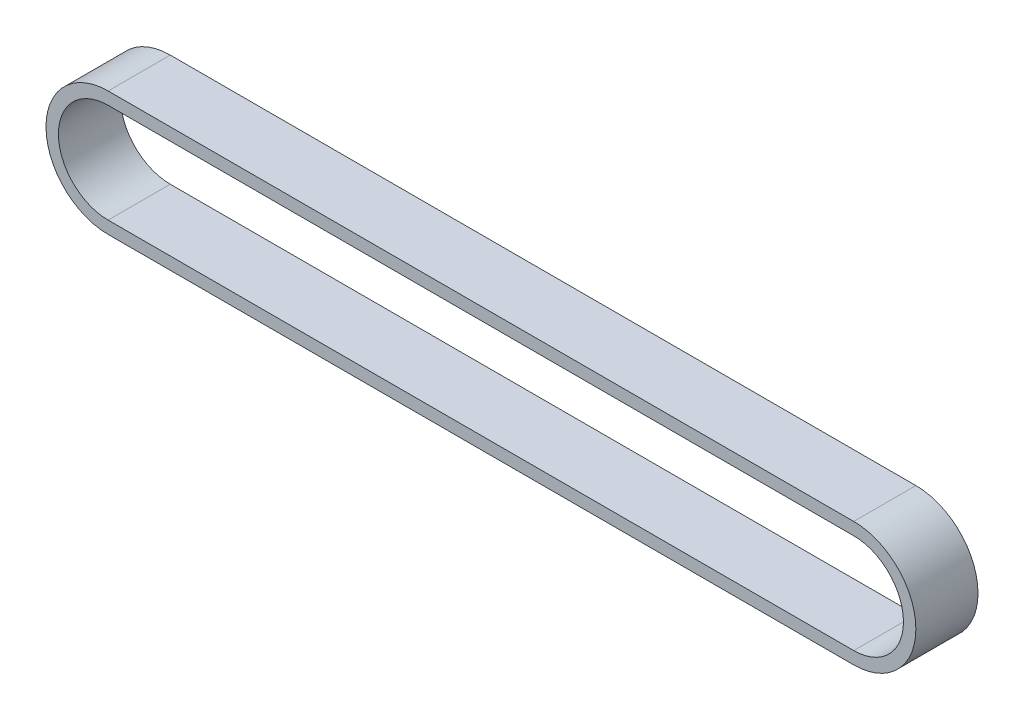
ISO-10303-21;
HEADER;
FILE_DESCRIPTION(('STEP AP214'),'2;1');
FILE_NAME('part.step','',(''),(''),'','','');
FILE_SCHEMA(('AUTOMOTIVE_DESIGN { 1 0 10303 214 1 1 1 1 }'));
ENDSEC;
DATA;
#1=APPLICATION_CONTEXT('core data for automotive mechanical design processes');
#2=APPLICATION_PROTOCOL_DEFINITION('international standard','automotive_design',2000,#1);
#3=PRODUCT_CONTEXT('',#1,'mechanical');
#4=PRODUCT('Part','Part','',(#3));
#5=PRODUCT_RELATED_PRODUCT_CATEGORY('part','',(#4));
#6=PRODUCT_DEFINITION_FORMATION('','',#4);
#7=PRODUCT_DEFINITION_CONTEXT('part definition',#1,'design');
#8=PRODUCT_DEFINITION('design','',#6,#7);
#9=PRODUCT_DEFINITION_SHAPE('','',#8);
#10=(LENGTH_UNIT() NAMED_UNIT(*) SI_UNIT(.MILLI.,.METRE.));
#11=(NAMED_UNIT(*) PLANE_ANGLE_UNIT() SI_UNIT($,.RADIAN.));
#12=(NAMED_UNIT(*) SI_UNIT($,.STERADIAN.) SOLID_ANGLE_UNIT());
#13=UNCERTAINTY_MEASURE_WITH_UNIT(LENGTH_MEASURE(1.E-05),#10,'distance_accuracy_value','');
#14=(GEOMETRIC_REPRESENTATION_CONTEXT(3) GLOBAL_UNCERTAINTY_ASSIGNED_CONTEXT((#13)) GLOBAL_UNIT_ASSIGNED_CONTEXT((#10,
#11,#12)) REPRESENTATION_CONTEXT('',''));
#15=CARTESIAN_POINT('',(0.,0.,0.));
#16=DIRECTION('',(0.,0.,1.));
#17=DIRECTION('',(1.,0.,0.));
#18=AXIS2_PLACEMENT_3D('',#15,#16,#17);
#19=CARTESIAN_POINT('',(0.,0.,25.));
#20=DIRECTION('',(0.,0.,1.));
#21=DIRECTION('',(1.,0.,0.));
#22=AXIS2_PLACEMENT_3D('',#19,#20,#21);
#23=PLANE('',#22);
#24=CARTESIAN_POINT('',(0.,0.,25.));
#25=DIRECTION('',(0.,0.,1.));
#26=DIRECTION('',(1.,0.,0.));
#27=AXIS2_PLACEMENT_3D('',#24,#25,#26);
#28=CIRCLE('',#27,25.);
#29=CARTESIAN_POINT('',(0.,25.,25.));
#30=VERTEX_POINT('',#29);
#31=CARTESIAN_POINT('',(0.,-25.,25.));
#32=VERTEX_POINT('',#31);
#33=EDGE_CURVE('E155',#30,#32,#28,.T.);
#34=ORIENTED_EDGE('',*,*,#33,.T.);
#35=DIRECTION('',(1.,0.,0.));
#36=VECTOR('',#35,1.);
#37=CARTESIAN_POINT('',(0.,-25.,25.));
#38=LINE('',#37,#36);
#39=CARTESIAN_POINT('',(300.,-25.,25.));
#40=VERTEX_POINT('',#39);
#41=EDGE_CURVE('E159',#32,#40,#38,.T.);
#42=ORIENTED_EDGE('',*,*,#41,.T.);
#43=CARTESIAN_POINT('',(300.,0.,25.));
#44=DIRECTION('',(0.,0.,1.));
#45=DIRECTION('',(1.,0.,0.));
#46=AXIS2_PLACEMENT_3D('',#43,#44,#45);
#47=CIRCLE('',#46,25.);
#48=CARTESIAN_POINT('',(300.,25.,25.));
#49=VERTEX_POINT('',#48);
#50=EDGE_CURVE('E163',#40,#49,#47,.T.);
#51=ORIENTED_EDGE('',*,*,#50,.T.);
#52=DIRECTION('',(-1.,0.,0.));
#53=VECTOR('',#52,1.);
#54=CARTESIAN_POINT('',(0.,25.,25.));
#55=LINE('',#54,#53);
#56=EDGE_CURVE('E166',#49,#30,#55,.T.);
#57=ORIENTED_EDGE('',*,*,#56,.T.);
#58=EDGE_LOOP('',(#34,#42,#51,#57));
#59=FACE_BOUND('',#58,.T.);
#60=DIRECTION('',(1.,0.,0.));
#61=VECTOR('',#60,1.);
#62=CARTESIAN_POINT('',(0.,-20.,25.));
#63=LINE('',#62,#61);
#64=CARTESIAN_POINT('',(0.,-20.,25.));
#65=VERTEX_POINT('',#64);
#66=CARTESIAN_POINT('',(300.,-20.,25.));
#67=VERTEX_POINT('',#66);
#68=EDGE_CURVE('E116',#65,#67,#63,.T.);
#69=ORIENTED_EDGE('',*,*,#68,.F.);
#70=CARTESIAN_POINT('',(0.,0.,25.));
#71=DIRECTION('',(0.,0.,1.));
#72=DIRECTION('',(1.,0.,0.));
#73=AXIS2_PLACEMENT_3D('',#70,#71,#72);
#74=CIRCLE('',#73,20.);
#75=CARTESIAN_POINT('',(0.,20.,25.));
#76=VERTEX_POINT('',#75);
#77=EDGE_CURVE('E107',#76,#65,#74,.T.);
#78=ORIENTED_EDGE('',*,*,#77,.F.);
#79=DIRECTION('',(-1.,0.,0.));
#80=VECTOR('',#79,1.);
#81=CARTESIAN_POINT('',(0.,20.,25.));
#82=LINE('',#81,#80);
#83=CARTESIAN_POINT('',(300.,20.,25.));
#84=VERTEX_POINT('',#83);
#85=EDGE_CURVE('E133',#84,#76,#82,.T.);
#86=ORIENTED_EDGE('',*,*,#85,.F.);
#87=CARTESIAN_POINT('',(300.,0.,25.));
#88=DIRECTION('',(0.,0.,1.));
#89=DIRECTION('',(1.,0.,0.));
#90=AXIS2_PLACEMENT_3D('',#87,#88,#89);
#91=CIRCLE('',#90,20.);
#92=EDGE_CURVE('E129',#67,#84,#91,.T.);
#93=ORIENTED_EDGE('',*,*,#92,.F.);
#94=EDGE_LOOP('',(#69,#78,#86,#93));
#95=FACE_BOUND('',#94,.T.);
#96=ADVANCED_FACE('F41',(#59,#95),#23,.T.);
#97=CARTESIAN_POINT('',(0.,0.,0.));
#98=DIRECTION('',(0.,0.,1.));
#99=DIRECTION('',(1.,0.,0.));
#100=AXIS2_PLACEMENT_3D('',#97,#98,#99);
#101=PLANE('',#100);
#102=CARTESIAN_POINT('',(0.,0.,0.));
#103=DIRECTION('',(0.,0.,1.));
#104=DIRECTION('',(1.,0.,0.));
#105=AXIS2_PLACEMENT_3D('',#102,#103,#104);
#106=CIRCLE('',#105,25.);
#107=CARTESIAN_POINT('',(0.,25.,0.));
#108=VERTEX_POINT('',#107);
#109=CARTESIAN_POINT('',(0.,-25.,0.));
#110=VERTEX_POINT('',#109);
#111=EDGE_CURVE('E125',#108,#110,#106,.T.);
#112=ORIENTED_EDGE('',*,*,#111,.F.);
#113=DIRECTION('',(-1.,0.,0.));
#114=VECTOR('',#113,1.);
#115=CARTESIAN_POINT('',(0.,25.,0.));
#116=LINE('',#115,#114);
#117=CARTESIAN_POINT('',(300.,25.,0.));
#118=VERTEX_POINT('',#117);
#119=EDGE_CURVE('E160',#118,#108,#116,.T.);
#120=ORIENTED_EDGE('',*,*,#119,.F.);
#121=CARTESIAN_POINT('',(300.,0.,0.));
#122=DIRECTION('',(0.,0.,1.));
#123=DIRECTION('',(1.,0.,0.));
#124=AXIS2_PLACEMENT_3D('',#121,#122,#123);
#125=CIRCLE('',#124,25.);
#126=CARTESIAN_POINT('',(300.,-25.,0.));
#127=VERTEX_POINT('',#126);
#128=EDGE_CURVE('E176',#127,#118,#125,.T.);
#129=ORIENTED_EDGE('',*,*,#128,.F.);
#130=DIRECTION('',(1.,0.,0.));
#131=VECTOR('',#130,1.);
#132=CARTESIAN_POINT('',(0.,-25.,0.));
#133=LINE('',#132,#131);
#134=EDGE_CURVE('E173',#110,#127,#133,.T.);
#135=ORIENTED_EDGE('',*,*,#134,.F.);
#136=EDGE_LOOP('',(#112,#120,#129,#135));
#137=FACE_BOUND('',#136,.T.);
#138=CARTESIAN_POINT('',(0.,0.,0.));
#139=DIRECTION('',(0.,0.,1.));
#140=DIRECTION('',(1.,0.,0.));
#141=AXIS2_PLACEMENT_3D('',#138,#139,#140);
#142=CIRCLE('',#141,20.);
#143=CARTESIAN_POINT('',(0.,20.,0.));
#144=VERTEX_POINT('',#143);
#145=CARTESIAN_POINT('',(0.,-20.,0.));
#146=VERTEX_POINT('',#145);
#147=EDGE_CURVE('E65',#144,#146,#142,.T.);
#148=ORIENTED_EDGE('',*,*,#147,.T.);
#149=DIRECTION('',(1.,0.,0.));
#150=VECTOR('',#149,1.);
#151=CARTESIAN_POINT('',(0.,-20.,0.));
#152=LINE('',#151,#150);
#153=CARTESIAN_POINT('',(300.,-20.,0.));
#154=VERTEX_POINT('',#153);
#155=EDGE_CURVE('E123',#146,#154,#152,.T.);
#156=ORIENTED_EDGE('',*,*,#155,.T.);
#157=CARTESIAN_POINT('',(300.,0.,0.));
#158=DIRECTION('',(0.,0.,1.));
#159=DIRECTION('',(1.,0.,0.));
#160=AXIS2_PLACEMENT_3D('',#157,#158,#159);
#161=CIRCLE('',#160,20.);
#162=CARTESIAN_POINT('',(300.,20.,0.));
#163=VERTEX_POINT('',#162);
#164=EDGE_CURVE('E142',#154,#163,#161,.T.);
#165=ORIENTED_EDGE('',*,*,#164,.T.);
#166=DIRECTION('',(-1.,0.,0.));
#167=VECTOR('',#166,1.);
#168=CARTESIAN_POINT('',(0.,20.,0.));
#169=LINE('',#168,#167);
#170=EDGE_CURVE('E117',#163,#144,#169,.T.);
#171=ORIENTED_EDGE('',*,*,#170,.T.);
#172=EDGE_LOOP('',(#148,#156,#165,#171));
#173=FACE_BOUND('',#172,.T.);
#174=ADVANCED_FACE('F199',(#137,#173),#101,.F.);
#175=CARTESIAN_POINT('',(0.,0.,25.));
#176=DIRECTION('',(0.,0.,-1.));
#177=DIRECTION('',(-1.,0.,0.));
#178=AXIS2_PLACEMENT_3D('',#175,#176,#177);
#179=CYLINDRICAL_SURFACE('',#178,25.);
#180=ORIENTED_EDGE('',*,*,#111,.T.);
#181=DIRECTION('',(0.,0.,-1.));
#182=VECTOR('',#181,1.);
#183=CARTESIAN_POINT('',(0.,-25.,25.));
#184=LINE('',#183,#182);
#185=EDGE_CURVE('E11',#32,#110,#184,.T.);
#186=ORIENTED_EDGE('',*,*,#185,.F.);
#187=ORIENTED_EDGE('',*,*,#33,.F.);
#188=DIRECTION('',(0.,0.,-1.));
#189=VECTOR('',#188,1.);
#190=CARTESIAN_POINT('',(0.,25.,25.));
#191=LINE('',#190,#189);
#192=EDGE_CURVE('E169',#30,#108,#191,.T.);
#193=ORIENTED_EDGE('',*,*,#192,.T.);
#194=EDGE_LOOP('',(#180,#186,#187,#193));
#195=FACE_BOUND('',#194,.T.);
#196=ADVANCED_FACE('F43',(#195),#179,.T.);
#197=CARTESIAN_POINT('',(0.,-25.,25.));
#198=DIRECTION('',(0.,1.,0.));
#199=DIRECTION('',(0.,0.,1.));
#200=AXIS2_PLACEMENT_3D('',#197,#198,#199);
#201=PLANE('',#200);
#202=ORIENTED_EDGE('',*,*,#134,.T.);
#203=DIRECTION('',(0.,0.,-1.));
#204=VECTOR('',#203,1.);
#205=CARTESIAN_POINT('',(300.,-25.,25.));
#206=LINE('',#205,#204);
#207=EDGE_CURVE('E50',#40,#127,#206,.T.);
#208=ORIENTED_EDGE('',*,*,#207,.F.);
#209=ORIENTED_EDGE('',*,*,#41,.F.);
#210=ORIENTED_EDGE('',*,*,#185,.T.);
#211=EDGE_LOOP('',(#202,#208,#209,#210));
#212=FACE_BOUND('',#211,.T.);
#213=ADVANCED_FACE('F209',(#212),#201,.F.);
#214=CARTESIAN_POINT('',(300.,0.,25.));
#215=DIRECTION('',(0.,0.,-1.));
#216=DIRECTION('',(-1.,0.,0.));
#217=AXIS2_PLACEMENT_3D('',#214,#215,#216);
#218=CYLINDRICAL_SURFACE('',#217,25.);
#219=ORIENTED_EDGE('',*,*,#128,.T.);
#220=DIRECTION('',(0.,0.,-1.));
#221=VECTOR('',#220,1.);
#222=CARTESIAN_POINT('',(300.,25.,25.));
#223=LINE('',#222,#221);
#224=EDGE_CURVE('E184',#49,#118,#223,.T.);
#225=ORIENTED_EDGE('',*,*,#224,.F.);
#226=ORIENTED_EDGE('',*,*,#50,.F.);
#227=ORIENTED_EDGE('',*,*,#207,.T.);
#228=EDGE_LOOP('',(#219,#225,#226,#227));
#229=FACE_BOUND('',#228,.T.);
#230=ADVANCED_FACE('F193',(#229),#218,.T.);
#231=CARTESIAN_POINT('',(0.,25.,25.));
#232=DIRECTION('',(0.,-1.,0.));
#233=DIRECTION('',(0.,0.,-1.));
#234=AXIS2_PLACEMENT_3D('',#231,#232,#233);
#235=PLANE('',#234);
#236=ORIENTED_EDGE('',*,*,#119,.T.);
#237=ORIENTED_EDGE('',*,*,#192,.F.);
#238=ORIENTED_EDGE('',*,*,#56,.F.);
#239=ORIENTED_EDGE('',*,*,#224,.T.);
#240=EDGE_LOOP('',(#236,#237,#238,#239));
#241=FACE_BOUND('',#240,.T.);
#242=ADVANCED_FACE('F203',(#241),#235,.F.);
#243=CARTESIAN_POINT('',(0.,0.,25.));
#244=DIRECTION('',(0.,0.,-1.));
#245=DIRECTION('',(-1.,0.,0.));
#246=AXIS2_PLACEMENT_3D('',#243,#244,#245);
#247=CYLINDRICAL_SURFACE('',#246,20.);
#248=ORIENTED_EDGE('',*,*,#147,.F.);
#249=DIRECTION('',(0.,0.,-1.));
#250=VECTOR('',#249,1.);
#251=CARTESIAN_POINT('',(0.,20.,25.));
#252=LINE('',#251,#250);
#253=EDGE_CURVE('E111',#76,#144,#252,.T.);
#254=ORIENTED_EDGE('',*,*,#253,.F.);
#255=ORIENTED_EDGE('',*,*,#77,.T.);
#256=DIRECTION('',(0.,0.,-1.));
#257=VECTOR('',#256,1.);
#258=CARTESIAN_POINT('',(0.,-20.,25.));
#259=LINE('',#258,#257);
#260=EDGE_CURVE('E110',#65,#146,#259,.T.);
#261=ORIENTED_EDGE('',*,*,#260,.T.);
#262=EDGE_LOOP('',(#248,#254,#255,#261));
#263=FACE_BOUND('',#262,.T.);
#264=ADVANCED_FACE('F109',(#263),#247,.F.);
#265=CARTESIAN_POINT('',(0.,-20.,25.));
#266=DIRECTION('',(0.,1.,0.));
#267=DIRECTION('',(0.,0.,1.));
#268=AXIS2_PLACEMENT_3D('',#265,#266,#267);
#269=PLANE('',#268);
#270=ORIENTED_EDGE('',*,*,#155,.F.);
#271=ORIENTED_EDGE('',*,*,#260,.F.);
#272=ORIENTED_EDGE('',*,*,#68,.T.);
#273=DIRECTION('',(0.,0.,-1.));
#274=VECTOR('',#273,1.);
#275=CARTESIAN_POINT('',(300.,-20.,25.));
#276=LINE('',#275,#274);
#277=EDGE_CURVE('E126',#67,#154,#276,.T.);
#278=ORIENTED_EDGE('',*,*,#277,.T.);
#279=EDGE_LOOP('',(#270,#271,#272,#278));
#280=FACE_BOUND('',#279,.T.);
#281=ADVANCED_FACE('F120',(#280),#269,.T.);
#282=CARTESIAN_POINT('',(300.,0.,25.));
#283=DIRECTION('',(0.,0.,-1.));
#284=DIRECTION('',(-1.,0.,0.));
#285=AXIS2_PLACEMENT_3D('',#282,#283,#284);
#286=CYLINDRICAL_SURFACE('',#285,20.);
#287=ORIENTED_EDGE('',*,*,#164,.F.);
#288=ORIENTED_EDGE('',*,*,#277,.F.);
#289=ORIENTED_EDGE('',*,*,#92,.T.);
#290=DIRECTION('',(0.,0.,-1.));
#291=VECTOR('',#290,1.);
#292=CARTESIAN_POINT('',(300.,20.,25.));
#293=LINE('',#292,#291);
#294=EDGE_CURVE('E57',#84,#163,#293,.T.);
#295=ORIENTED_EDGE('',*,*,#294,.T.);
#296=EDGE_LOOP('',(#287,#288,#289,#295));
#297=FACE_BOUND('',#296,.T.);
#298=ADVANCED_FACE('F232',(#297),#286,.F.);
#299=CARTESIAN_POINT('',(0.,20.,25.));
#300=DIRECTION('',(0.,-1.,0.));
#301=DIRECTION('',(0.,0.,-1.));
#302=AXIS2_PLACEMENT_3D('',#299,#300,#301);
#303=PLANE('',#302);
#304=ORIENTED_EDGE('',*,*,#170,.F.);
#305=ORIENTED_EDGE('',*,*,#294,.F.);
#306=ORIENTED_EDGE('',*,*,#85,.T.);
#307=ORIENTED_EDGE('',*,*,#253,.T.);
#308=EDGE_LOOP('',(#304,#305,#306,#307));
#309=FACE_BOUND('',#308,.T.);
#310=ADVANCED_FACE('F236',(#309),#303,.T.);
#311=CLOSED_SHELL('',(#96,#174,#196,#213,#230,#242,#264,#281,#298,#310));
#312=MANIFOLD_SOLID_BREP('B2',#311);
#313=ADVANCED_BREP_SHAPE_REPRESENTATION('',(#18,#312),#14);
#314=SHAPE_DEFINITION_REPRESENTATION(#9,#313);
ENDSEC;
END-ISO-10303-21;
